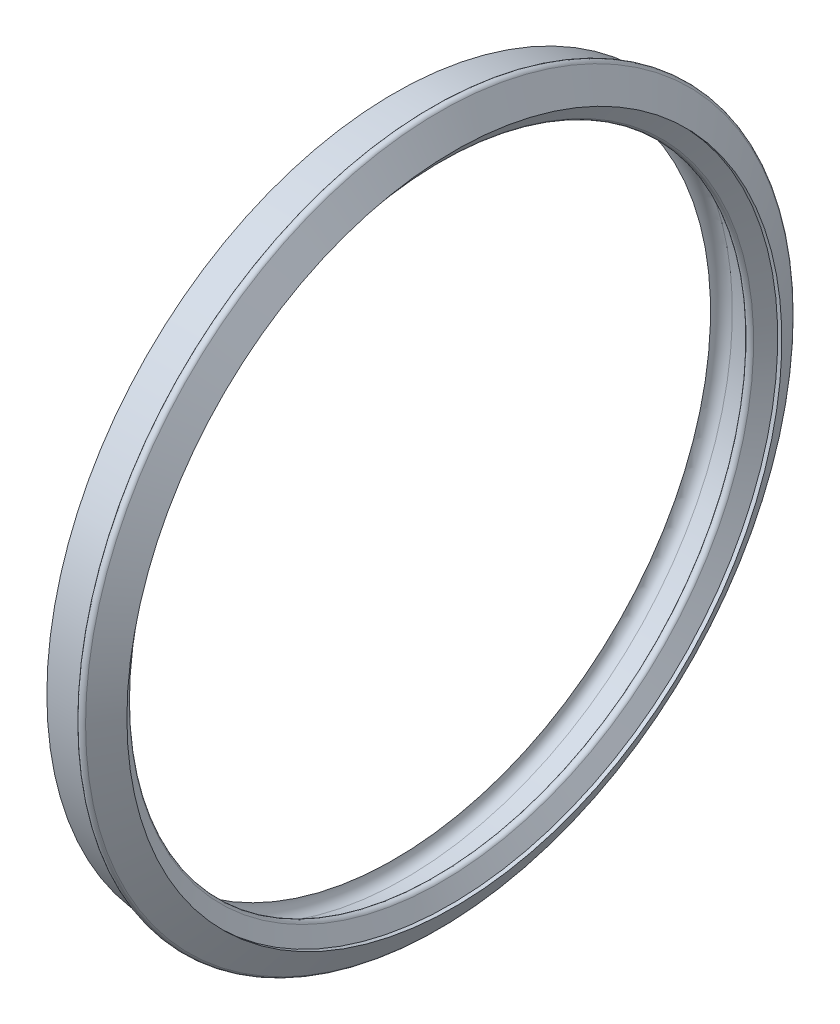
ISO-10303-21;
HEADER;
FILE_DESCRIPTION(('STEP AP214'),'2;1');
FILE_NAME('part.step','',(''),(''),'','','');
FILE_SCHEMA(('AUTOMOTIVE_DESIGN { 1 0 10303 214 1 1 1 1 }'));
ENDSEC;
DATA;
#1=APPLICATION_CONTEXT('core data for automotive mechanical design processes');
#2=APPLICATION_PROTOCOL_DEFINITION('international standard','automotive_design',2000,#1);
#3=PRODUCT_CONTEXT('',#1,'mechanical');
#4=PRODUCT('Part','Part','',(#3));
#5=PRODUCT_RELATED_PRODUCT_CATEGORY('part','',(#4));
#6=PRODUCT_DEFINITION_FORMATION('','',#4);
#7=PRODUCT_DEFINITION_CONTEXT('part definition',#1,'design');
#8=PRODUCT_DEFINITION('design','',#6,#7);
#9=PRODUCT_DEFINITION_SHAPE('','',#8);
#10=(LENGTH_UNIT() NAMED_UNIT(*) SI_UNIT(.MILLI.,.METRE.));
#11=(NAMED_UNIT(*) PLANE_ANGLE_UNIT() SI_UNIT($,.RADIAN.));
#12=(NAMED_UNIT(*) SI_UNIT($,.STERADIAN.) SOLID_ANGLE_UNIT());
#13=UNCERTAINTY_MEASURE_WITH_UNIT(LENGTH_MEASURE(1.E-05),#10,'distance_accuracy_value','');
#14=(GEOMETRIC_REPRESENTATION_CONTEXT(3) GLOBAL_UNCERTAINTY_ASSIGNED_CONTEXT((#13)) GLOBAL_UNIT_ASSIGNED_CONTEXT((#10,
#11,#12)) REPRESENTATION_CONTEXT('',''));
#15=CARTESIAN_POINT('',(0.,0.,0.));
#16=DIRECTION('',(0.,0.,1.));
#17=DIRECTION('',(1.,0.,0.));
#18=AXIS2_PLACEMENT_3D('',#15,#16,#17);
#19=CARTESIAN_POINT('',(0.,15.9,0.));
#20=DIRECTION('',(1.,0.,0.));
#21=DIRECTION('',(0.,0.,-1.));
#22=AXIS2_PLACEMENT_3D('',#19,#20,#21);
#23=PLANE('',#22);
#24=CARTESIAN_POINT('',(0.,0.,0.));
#25=DIRECTION('',(-1.,0.,0.));
#26=DIRECTION('',(0.,0.,1.));
#27=AXIS2_PLACEMENT_3D('',#24,#25,#26);
#28=CIRCLE('',#27,15.9);
#29=CARTESIAN_POINT('',(0.,0.,15.9));
#30=VERTEX_POINT('',#29);
#31=EDGE_CURVE('E63',#30,#30,#28,.T.);
#32=ORIENTED_EDGE('',*,*,#31,.T.);
#33=EDGE_LOOP('',(#32));
#34=FACE_BOUND('',#33,.T.);
#35=CARTESIAN_POINT('',(0.,0.,0.));
#36=DIRECTION('',(-1.,0.,0.));
#37=DIRECTION('',(0.,0.,1.));
#38=AXIS2_PLACEMENT_3D('',#35,#36,#37);
#39=CIRCLE('',#38,14.5);
#40=CARTESIAN_POINT('',(0.,0.,14.5));
#41=VERTEX_POINT('',#40);
#42=EDGE_CURVE('E69',#41,#41,#39,.T.);
#43=ORIENTED_EDGE('',*,*,#42,.F.);
#44=EDGE_LOOP('',(#43));
#45=FACE_BOUND('',#44,.T.);
#46=ADVANCED_FACE('F32',(#34,#45),#23,.F.);
#47=CARTESIAN_POINT('',(0.,0.,0.));
#48=DIRECTION('',(-1.,0.,0.));
#49=DIRECTION('',(0.,0.,1.));
#50=AXIS2_PLACEMENT_3D('',#47,#48,#49);
#51=CYLINDRICAL_SURFACE('',#50,15.);
#52=CARTESIAN_POINT('',(0.499999999999932,0.,0.));
#53=DIRECTION('',(-1.,0.,0.));
#54=DIRECTION('',(0.,0.,1.));
#55=AXIS2_PLACEMENT_3D('',#52,#53,#54);
#56=CIRCLE('',#55,15.);
#57=CARTESIAN_POINT('',(0.499999999999932,0.,15.));
#58=VERTEX_POINT('',#57);
#59=EDGE_CURVE('E66',#58,#58,#56,.T.);
#60=ORIENTED_EDGE('',*,*,#59,.T.);
#61=EDGE_LOOP('',(#60));
#62=FACE_BOUND('',#61,.T.);
#63=CARTESIAN_POINT('',(1.42264973081036,0.,0.));
#64=DIRECTION('',(-1.,0.,0.));
#65=DIRECTION('',(0.,0.,1.));
#66=AXIS2_PLACEMENT_3D('',#63,#64,#65);
#67=CIRCLE('',#66,15.);
#68=CARTESIAN_POINT('',(1.42264973081036,0.,15.));
#69=VERTEX_POINT('',#68);
#70=EDGE_CURVE('E10',#69,#69,#67,.T.);
#71=ORIENTED_EDGE('',*,*,#70,.F.);
#72=EDGE_LOOP('',(#71));
#73=FACE_BOUND('',#72,.T.);
#74=ADVANCED_FACE('F76',(#62,#73),#51,.F.);
#75=CARTESIAN_POINT('',(1.42264973081036,0.,0.));
#76=DIRECTION('',(-1.,0.,0.));
#77=DIRECTION('',(0.,0.,1.));
#78=AXIS2_PLACEMENT_3D('',#75,#76,#77);
#79=CONICAL_SURFACE('',#78,15.,1.04719755119653);
#80=CARTESIAN_POINT('',(1.82679491924314,0.,0.));
#81=DIRECTION('',(-1.,0.,0.));
#82=DIRECTION('',(0.,0.,1.));
#83=AXIS2_PLACEMENT_3D('',#80,#81,#82);
#84=CIRCLE('',#83,14.3);
#85=CARTESIAN_POINT('',(1.82679491924314,0.,14.3));
#86=VERTEX_POINT('',#85);
#87=EDGE_CURVE('E38',#86,#86,#84,.T.);
#88=ORIENTED_EDGE('',*,*,#87,.F.);
#89=EDGE_LOOP('',(#88));
#90=FACE_BOUND('',#89,.T.);
#91=ORIENTED_EDGE('',*,*,#70,.T.);
#92=EDGE_LOOP('',(#91));
#93=FACE_BOUND('',#92,.T.);
#94=ADVANCED_FACE('F81',(#90,#93),#79,.F.);
#95=CARTESIAN_POINT('',(2.00000000000005,0.,0.));
#96=DIRECTION('',(-1.,0.,0.));
#97=DIRECTION('',(0.,0.,1.));
#98=AXIS2_PLACEMENT_3D('',#95,#96,#97);
#99=TOROIDAL_SURFACE('',#98,14.4,0.2);
#100=CARTESIAN_POINT('',(2.17320508075688,0.,0.));
#101=DIRECTION('',(-1.,0.,0.));
#102=DIRECTION('',(0.,0.,1.));
#103=AXIS2_PLACEMENT_3D('',#100,#101,#102);
#104=CIRCLE('',#103,14.3);
#105=CARTESIAN_POINT('',(2.17320508075688,0.,14.3));
#106=VERTEX_POINT('',#105);
#107=EDGE_CURVE('E42',#106,#106,#104,.T.);
#108=ORIENTED_EDGE('',*,*,#107,.F.);
#109=EDGE_LOOP('',(#108));
#110=FACE_BOUND('',#109,.T.);
#111=ORIENTED_EDGE('',*,*,#87,.T.);
#112=EDGE_LOOP('',(#111));
#113=FACE_BOUND('',#112,.T.);
#114=ADVANCED_FACE('F118',(#110,#113),#99,.T.);
#115=CARTESIAN_POINT('',(2.17320508075688,0.,0.));
#116=DIRECTION('',(1.,0.,0.));
#117=DIRECTION('',(0.,0.,-1.));
#118=AXIS2_PLACEMENT_3D('',#115,#116,#117);
#119=CONICAL_SURFACE('',#118,14.3,1.04719755119661);
#120=CARTESIAN_POINT('',(2.57735026918961,0.,0.));
#121=DIRECTION('',(-1.,0.,0.));
#122=DIRECTION('',(0.,0.,1.));
#123=AXIS2_PLACEMENT_3D('',#120,#121,#122);
#124=CIRCLE('',#123,15.);
#125=CARTESIAN_POINT('',(2.57735026918961,0.,15.));
#126=VERTEX_POINT('',#125);
#127=EDGE_CURVE('E46',#126,#126,#124,.T.);
#128=ORIENTED_EDGE('',*,*,#127,.F.);
#129=EDGE_LOOP('',(#128));
#130=FACE_BOUND('',#129,.T.);
#131=ORIENTED_EDGE('',*,*,#107,.T.);
#132=EDGE_LOOP('',(#131));
#133=FACE_BOUND('',#132,.T.);
#134=ADVANCED_FACE('F112',(#130,#133),#119,.F.);
#135=CARTESIAN_POINT('',(0.,0.,0.));
#136=DIRECTION('',(-1.,0.,0.));
#137=DIRECTION('',(0.,0.,1.));
#138=AXIS2_PLACEMENT_3D('',#135,#136,#137);
#139=CYLINDRICAL_SURFACE('',#138,15.);
#140=CARTESIAN_POINT('',(2.76602540378438,0.,0.));
#141=DIRECTION('',(-1.,0.,0.));
#142=DIRECTION('',(0.,0.,1.));
#143=AXIS2_PLACEMENT_3D('',#140,#141,#142);
#144=CIRCLE('',#143,15.);
#145=CARTESIAN_POINT('',(2.76602540378438,0.,15.));
#146=VERTEX_POINT('',#145);
#147=EDGE_CURVE('E51',#146,#146,#144,.T.);
#148=ORIENTED_EDGE('',*,*,#147,.F.);
#149=EDGE_LOOP('',(#148));
#150=FACE_BOUND('',#149,.T.);
#151=ORIENTED_EDGE('',*,*,#127,.T.);
#152=EDGE_LOOP('',(#151));
#153=FACE_BOUND('',#152,.T.);
#154=ADVANCED_FACE('F106',(#150,#153),#139,.F.);
#155=CARTESIAN_POINT('',(2.76602540378438,0.,0.));
#156=DIRECTION('',(-1.,0.,0.));
#157=DIRECTION('',(0.,0.,1.));
#158=AXIS2_PLACEMENT_3D('',#155,#156,#157);
#159=CONICAL_SURFACE('',#158,15.,1.04719755119659);
#160=CARTESIAN_POINT('',(2.07320508075688,0.,0.));
#161=DIRECTION('',(-1.,0.,0.));
#162=DIRECTION('',(0.,0.,1.));
#163=AXIS2_PLACEMENT_3D('',#160,#161,#162);
#164=CIRCLE('',#163,16.1999999999999);
#165=CARTESIAN_POINT('',(2.07320508075688,0.,16.1999999999999));
#166=VERTEX_POINT('',#165);
#167=EDGE_CURVE('E54',#166,#166,#164,.T.);
#168=ORIENTED_EDGE('',*,*,#167,.F.);
#169=EDGE_LOOP('',(#168));
#170=FACE_BOUND('',#169,.T.);
#171=ORIENTED_EDGE('',*,*,#147,.T.);
#172=EDGE_LOOP('',(#171));
#173=FACE_BOUND('',#172,.T.);
#174=ADVANCED_FACE('F100',(#170,#173),#159,.T.);
#175=CARTESIAN_POINT('',(1.89999999999999,0.,0.));
#176=DIRECTION('',(-1.,0.,0.));
#177=DIRECTION('',(0.,0.,1.));
#178=AXIS2_PLACEMENT_3D('',#175,#176,#177);
#179=TOROIDAL_SURFACE('',#178,16.0999999999999,0.200000000000001);
#180=CARTESIAN_POINT('',(1.7267949192431,0.,0.));
#181=DIRECTION('',(-1.,0.,0.));
#182=DIRECTION('',(0.,0.,1.));
#183=AXIS2_PLACEMENT_3D('',#180,#181,#182);
#184=CIRCLE('',#183,16.1999999999999);
#185=CARTESIAN_POINT('',(1.7267949192431,0.,16.1999999999999));
#186=VERTEX_POINT('',#185);
#187=EDGE_CURVE('E57',#186,#186,#184,.T.);
#188=ORIENTED_EDGE('',*,*,#187,.F.);
#189=EDGE_LOOP('',(#188));
#190=FACE_BOUND('',#189,.T.);
#191=ORIENTED_EDGE('',*,*,#167,.T.);
#192=EDGE_LOOP('',(#191));
#193=FACE_BOUND('',#192,.T.);
#194=ADVANCED_FACE('F94',(#190,#193),#179,.T.);
#195=CARTESIAN_POINT('',(1.7267949192431,0.,0.));
#196=DIRECTION('',(1.,0.,0.));
#197=DIRECTION('',(0.,0.,-1.));
#198=AXIS2_PLACEMENT_3D('',#195,#196,#197);
#199=CONICAL_SURFACE('',#198,16.1999999999999,1.04719755119661);
#200=CARTESIAN_POINT('',(1.55358983848627,0.,0.));
#201=DIRECTION('',(-1.,0.,0.));
#202=DIRECTION('',(0.,0.,1.));
#203=AXIS2_PLACEMENT_3D('',#200,#201,#202);
#204=CIRCLE('',#203,15.9);
#205=CARTESIAN_POINT('',(1.55358983848627,0.,15.9));
#206=VERTEX_POINT('',#205);
#207=EDGE_CURVE('E60',#206,#206,#204,.T.);
#208=ORIENTED_EDGE('',*,*,#207,.F.);
#209=EDGE_LOOP('',(#208));
#210=FACE_BOUND('',#209,.T.);
#211=ORIENTED_EDGE('',*,*,#187,.T.);
#212=EDGE_LOOP('',(#211));
#213=FACE_BOUND('',#212,.T.);
#214=ADVANCED_FACE('F88',(#210,#213),#199,.T.);
#215=CARTESIAN_POINT('',(0.,0.,0.));
#216=DIRECTION('',(-1.,0.,0.));
#217=DIRECTION('',(0.,0.,1.));
#218=AXIS2_PLACEMENT_3D('',#215,#216,#217);
#219=CYLINDRICAL_SURFACE('',#218,15.9);
#220=ORIENTED_EDGE('',*,*,#31,.F.);
#221=EDGE_LOOP('',(#220));
#222=FACE_BOUND('',#221,.T.);
#223=ORIENTED_EDGE('',*,*,#207,.T.);
#224=EDGE_LOOP('',(#223));
#225=FACE_BOUND('',#224,.T.);
#226=ADVANCED_FACE('F85',(#222,#225),#219,.T.);
#227=CARTESIAN_POINT('',(0.499999999999929,0.,0.));
#228=DIRECTION('',(-1.,0.,0.));
#229=DIRECTION('',(0.,0.,1.));
#230=AXIS2_PLACEMENT_3D('',#227,#228,#229);
#231=TOROIDAL_SURFACE('',#230,14.5,0.5);
#232=ORIENTED_EDGE('',*,*,#59,.F.);
#233=EDGE_LOOP('',(#232));
#234=FACE_BOUND('',#233,.T.);
#235=ORIENTED_EDGE('',*,*,#42,.T.);
#236=EDGE_LOOP('',(#235));
#237=FACE_BOUND('',#236,.T.);
#238=ADVANCED_FACE('F73',(#234,#237),#231,.F.);
#239=CLOSED_SHELL('',(#46,#74,#94,#114,#134,#154,#174,#194,#214,#226,#238));
#240=MANIFOLD_SOLID_BREP('B2',#239);
#241=ADVANCED_BREP_SHAPE_REPRESENTATION('',(#18,#240),#14);
#242=SHAPE_DEFINITION_REPRESENTATION(#9,#241);
ENDSEC;
END-ISO-10303-21;
